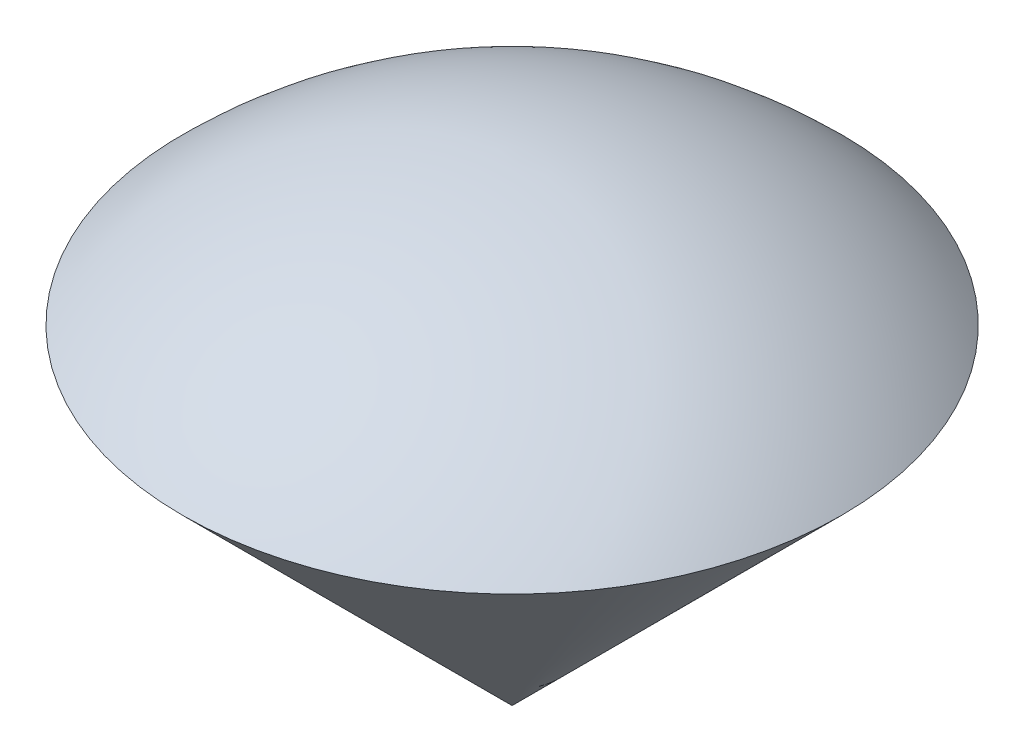
ISO-10303-21;
HEADER;
FILE_DESCRIPTION(('STEP AP214'),'2;1');
FILE_NAME('part.step','',(''),(''),'','','');
FILE_SCHEMA(('AUTOMOTIVE_DESIGN { 1 0 10303 214 1 1 1 1 }'));
ENDSEC;
DATA;
#1=APPLICATION_CONTEXT('core data for automotive mechanical design processes');
#2=APPLICATION_PROTOCOL_DEFINITION('international standard','automotive_design',2000,#1);
#3=PRODUCT_CONTEXT('',#1,'mechanical');
#4=PRODUCT('Part','Part','',(#3));
#5=PRODUCT_RELATED_PRODUCT_CATEGORY('part','',(#4));
#6=PRODUCT_DEFINITION_FORMATION('','',#4);
#7=PRODUCT_DEFINITION_CONTEXT('part definition',#1,'design');
#8=PRODUCT_DEFINITION('design','',#6,#7);
#9=PRODUCT_DEFINITION_SHAPE('','',#8);
#10=(LENGTH_UNIT() NAMED_UNIT(*) SI_UNIT(.MILLI.,.METRE.));
#11=(NAMED_UNIT(*) PLANE_ANGLE_UNIT() SI_UNIT($,.RADIAN.));
#12=(NAMED_UNIT(*) SI_UNIT($,.STERADIAN.) SOLID_ANGLE_UNIT());
#13=UNCERTAINTY_MEASURE_WITH_UNIT(LENGTH_MEASURE(1.E-05),#10,'distance_accuracy_value','');
#14=(GEOMETRIC_REPRESENTATION_CONTEXT(3) GLOBAL_UNCERTAINTY_ASSIGNED_CONTEXT((#13)) GLOBAL_UNIT_ASSIGNED_CONTEXT((#10,
#11,#12)) REPRESENTATION_CONTEXT('',''));
#15=CARTESIAN_POINT('',(0.,0.,0.));
#16=DIRECTION('',(0.,0.,1.));
#17=DIRECTION('',(1.,0.,0.));
#18=AXIS2_PLACEMENT_3D('',#15,#16,#17);
#19=CARTESIAN_POINT('',(0.,0.,0.));
#20=DIRECTION('',(0.,1.,0.));
#21=DIRECTION('',(0.,0.,1.));
#22=AXIS2_PLACEMENT_3D('',#19,#20,#21);
#23=CONICAL_SURFACE('',#22,0.,0.78539816339745);
#24=CARTESIAN_POINT('',(0.,3.53553390593273,0.));
#25=DIRECTION('',(0.,-1.,0.));
#26=DIRECTION('',(0.,0.,-1.));
#27=AXIS2_PLACEMENT_3D('',#24,#25,#26);
#28=CIRCLE('',#27,3.53553390593274);
#29=CARTESIAN_POINT('',(0.,3.53553390593273,-3.53553390593274));
#30=VERTEX_POINT('',#29);
#31=EDGE_CURVE('E11',#30,#30,#28,.T.);
#32=ORIENTED_EDGE('',*,*,#31,.T.);
#33=EDGE_LOOP('',(#32));
#34=FACE_BOUND('',#33,.T.);
#35=CARTESIAN_POINT('',(0.,0.,0.));
#36=VERTEX_POINT('',#35);
#37=VERTEX_LOOP('',#36);
#38=FACE_BOUND('',#37,.T.);
#39=ADVANCED_FACE('F33',(#34,#38),#23,.T.);
#40=CARTESIAN_POINT('',(0.,0.,0.));
#41=DIRECTION('',(0.,-1.,0.));
#42=DIRECTION('',(1.,0.,0.));
#43=AXIS2_PLACEMENT_3D('',#40,#41,#42);
#44=SPHERICAL_SURFACE('',#43,5.);
#45=ORIENTED_EDGE('',*,*,#31,.F.);
#46=EDGE_LOOP('',(#45));
#47=FACE_BOUND('',#46,.T.);
#48=ADVANCED_FACE('F41',(#47),#44,.T.);
#49=CLOSED_SHELL('',(#39,#48));
#50=MANIFOLD_SOLID_BREP('B2',#49);
#51=ADVANCED_BREP_SHAPE_REPRESENTATION('',(#18,#50),#14);
#52=SHAPE_DEFINITION_REPRESENTATION(#9,#51);
ENDSEC;
END-ISO-10303-21;
